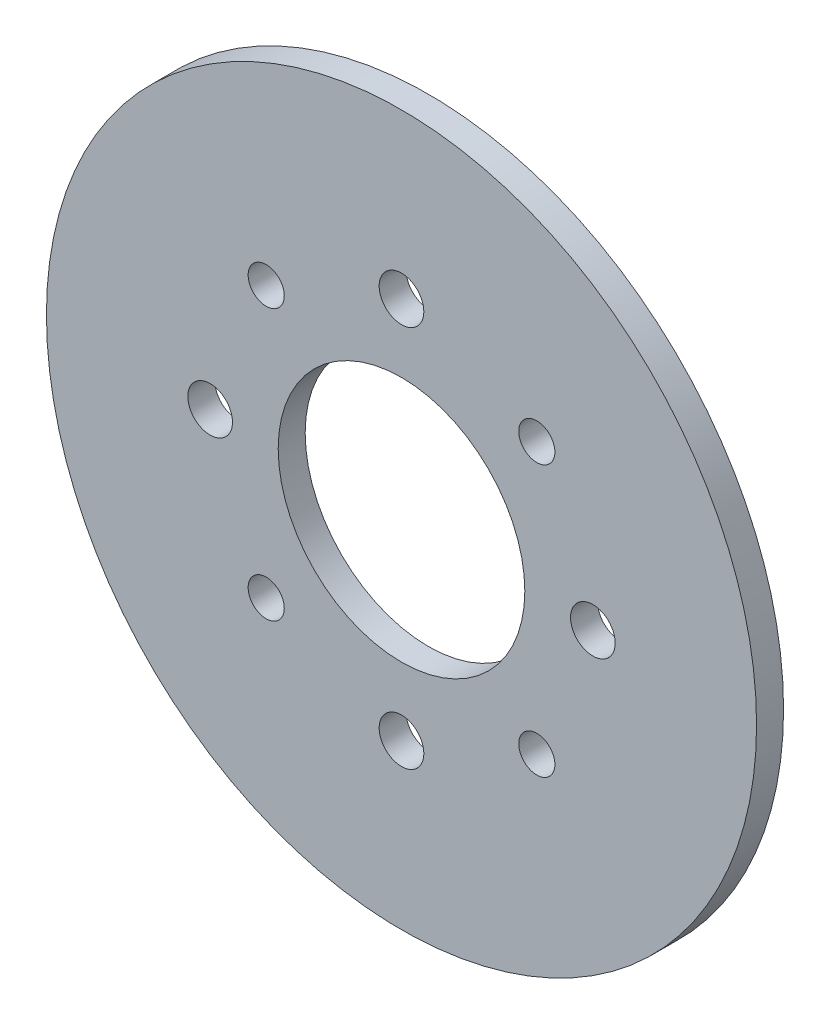
ISO-10303-21;
HEADER;
FILE_DESCRIPTION(('STEP AP214'),'2;1');
FILE_NAME('part.step','',(''),(''),'','','');
FILE_SCHEMA(('AUTOMOTIVE_DESIGN { 1 0 10303 214 1 1 1 1 }'));
ENDSEC;
DATA;
#1=APPLICATION_CONTEXT('core data for automotive mechanical design processes');
#2=APPLICATION_PROTOCOL_DEFINITION('international standard','automotive_design',2000,#1);
#3=PRODUCT_CONTEXT('',#1,'mechanical');
#4=PRODUCT('Part','Part','',(#3));
#5=PRODUCT_RELATED_PRODUCT_CATEGORY('part','',(#4));
#6=PRODUCT_DEFINITION_FORMATION('','',#4);
#7=PRODUCT_DEFINITION_CONTEXT('part definition',#1,'design');
#8=PRODUCT_DEFINITION('design','',#6,#7);
#9=PRODUCT_DEFINITION_SHAPE('','',#8);
#10=(LENGTH_UNIT() NAMED_UNIT(*) SI_UNIT(.MILLI.,.METRE.));
#11=(NAMED_UNIT(*) PLANE_ANGLE_UNIT() SI_UNIT($,.RADIAN.));
#12=(NAMED_UNIT(*) SI_UNIT($,.STERADIAN.) SOLID_ANGLE_UNIT());
#13=UNCERTAINTY_MEASURE_WITH_UNIT(LENGTH_MEASURE(1.E-05),#10,'distance_accuracy_value','');
#14=(GEOMETRIC_REPRESENTATION_CONTEXT(3) GLOBAL_UNCERTAINTY_ASSIGNED_CONTEXT((#13)) GLOBAL_UNIT_ASSIGNED_CONTEXT((#10,
#11,#12)) REPRESENTATION_CONTEXT('',''));
#15=CARTESIAN_POINT('',(0.,0.,0.));
#16=DIRECTION('',(0.,0.,1.));
#17=DIRECTION('',(1.,0.,0.));
#18=AXIS2_PLACEMENT_3D('',#15,#16,#17);
#19=CARTESIAN_POINT('',(0.,0.,6.35));
#20=DIRECTION('',(0.,0.,1.));
#21=DIRECTION('',(1.,0.,0.));
#22=AXIS2_PLACEMENT_3D('',#19,#20,#21);
#23=PLANE('',#22);
#24=CARTESIAN_POINT('',(-31.8198051534,-31.8198051533893,6.35));
#25=DIRECTION('',(0.,0.,1.));
#26=DIRECTION('',(1.,0.,0.));
#27=AXIS2_PLACEMENT_3D('',#24,#25,#26);
#28=CIRCLE('',#27,4.24999999999688);
#29=CARTESIAN_POINT('',(-27.5698051534031,-31.8198051533893,6.35));
#30=VERTEX_POINT('',#29);
#31=EDGE_CURVE('E89',#30,#30,#28,.T.);
#32=ORIENTED_EDGE('',*,*,#31,.F.);
#33=EDGE_LOOP('',(#32));
#34=FACE_BOUND('',#33,.T.);
#35=CARTESIAN_POINT('',(-45.,0.,6.35));
#36=DIRECTION('',(0.,0.,1.));
#37=DIRECTION('',(1.,0.,0.));
#38=AXIS2_PLACEMENT_3D('',#35,#36,#37);
#39=CIRCLE('',#38,5.25);
#40=CARTESIAN_POINT('',(-39.75,0.,6.35));
#41=VERTEX_POINT('',#40);
#42=EDGE_CURVE('E77',#41,#41,#39,.T.);
#43=ORIENTED_EDGE('',*,*,#42,.F.);
#44=EDGE_LOOP('',(#43));
#45=FACE_BOUND('',#44,.T.);
#46=CARTESIAN_POINT('',(45.,0.,6.35));
#47=DIRECTION('',(0.,0.,1.));
#48=DIRECTION('',(1.,0.,0.));
#49=AXIS2_PLACEMENT_3D('',#46,#47,#48);
#50=CIRCLE('',#49,5.25);
#51=CARTESIAN_POINT('',(50.25,0.,6.35));
#52=VERTEX_POINT('',#51);
#53=EDGE_CURVE('E65',#52,#52,#50,.T.);
#54=ORIENTED_EDGE('',*,*,#53,.F.);
#55=EDGE_LOOP('',(#54));
#56=FACE_BOUND('',#55,.T.);
#57=CARTESIAN_POINT('',(0.,45.,6.35));
#58=DIRECTION('',(0.,0.,1.));
#59=DIRECTION('',(1.,0.,0.));
#60=AXIS2_PLACEMENT_3D('',#57,#58,#59);
#61=CIRCLE('',#60,5.25);
#62=CARTESIAN_POINT('',(5.25,45.,6.35));
#63=VERTEX_POINT('',#62);
#64=EDGE_CURVE('E53',#63,#63,#61,.T.);
#65=ORIENTED_EDGE('',*,*,#64,.F.);
#66=EDGE_LOOP('',(#65));
#67=FACE_BOUND('',#66,.T.);
#68=CARTESIAN_POINT('',(0.,0.,6.35));
#69=DIRECTION('',(0.,0.,1.));
#70=DIRECTION('',(1.,0.,0.));
#71=AXIS2_PLACEMENT_3D('',#68,#69,#70);
#72=CIRCLE('',#71,83.5033704758752);
#73=CARTESIAN_POINT('',(83.5033704758752,0.,6.35));
#74=VERTEX_POINT('',#73);
#75=EDGE_CURVE('E10',#74,#74,#72,.T.);
#76=ORIENTED_EDGE('',*,*,#75,.T.);
#77=EDGE_LOOP('',(#76));
#78=FACE_BOUND('',#77,.T.);
#79=CARTESIAN_POINT('',(31.8198051534,31.8198051533893,6.35));
#80=DIRECTION('',(0.,0.,1.));
#81=DIRECTION('',(1.,0.,0.));
#82=AXIS2_PLACEMENT_3D('',#79,#80,#81);
#83=CIRCLE('',#82,4.24999999999288);
#84=CARTESIAN_POINT('',(36.0698051533929,31.8198051533893,6.35));
#85=VERTEX_POINT('',#84);
#86=EDGE_CURVE('E48',#85,#85,#83,.T.);
#87=ORIENTED_EDGE('',*,*,#86,.F.);
#88=EDGE_LOOP('',(#87));
#89=FACE_BOUND('',#88,.T.);
#90=CARTESIAN_POINT('',(0.,0.,6.35));
#91=DIRECTION('',(0.,0.,1.));
#92=DIRECTION('',(1.,0.,0.));
#93=AXIS2_PLACEMENT_3D('',#90,#91,#92);
#94=CIRCLE('',#93,29.);
#95=CARTESIAN_POINT('',(29.,0.,6.35));
#96=VERTEX_POINT('',#95);
#97=EDGE_CURVE('E59',#96,#96,#94,.T.);
#98=ORIENTED_EDGE('',*,*,#97,.F.);
#99=EDGE_LOOP('',(#98));
#100=FACE_BOUND('',#99,.T.);
#101=CARTESIAN_POINT('',(0.,-45.,6.35));
#102=DIRECTION('',(0.,0.,1.));
#103=DIRECTION('',(1.,0.,0.));
#104=AXIS2_PLACEMENT_3D('',#101,#102,#103);
#105=CIRCLE('',#104,5.25);
#106=CARTESIAN_POINT('',(5.25,-45.,6.35));
#107=VERTEX_POINT('',#106);
#108=EDGE_CURVE('E71',#107,#107,#105,.T.);
#109=ORIENTED_EDGE('',*,*,#108,.F.);
#110=EDGE_LOOP('',(#109));
#111=FACE_BOUND('',#110,.T.);
#112=CARTESIAN_POINT('',(31.8198051533893,-31.8198051534,6.35));
#113=DIRECTION('',(0.,0.,1.));
#114=DIRECTION('',(1.,0.,0.));
#115=AXIS2_PLACEMENT_3D('',#112,#113,#114);
#116=CIRCLE('',#115,4.25000000001028);
#117=CARTESIAN_POINT('',(36.0698051533996,-31.8198051534,6.35));
#118=VERTEX_POINT('',#117);
#119=EDGE_CURVE('E83',#118,#118,#116,.T.);
#120=ORIENTED_EDGE('',*,*,#119,.F.);
#121=EDGE_LOOP('',(#120));
#122=FACE_BOUND('',#121,.T.);
#123=CARTESIAN_POINT('',(-31.8198051533893,31.8198051534,6.35));
#124=DIRECTION('',(0.,0.,1.));
#125=DIRECTION('',(1.,0.,0.));
#126=AXIS2_PLACEMENT_3D('',#123,#124,#125);
#127=CIRCLE('',#126,4.24999999998973);
#128=CARTESIAN_POINT('',(-27.5698051533995,31.8198051534,6.35));
#129=VERTEX_POINT('',#128);
#130=EDGE_CURVE('E95',#129,#129,#127,.T.);
#131=ORIENTED_EDGE('',*,*,#130,.F.);
#132=EDGE_LOOP('',(#131));
#133=FACE_BOUND('',#132,.T.);
#134=ADVANCED_FACE('F37',(#34,#45,#56,#67,#78,#89,#100,#111,#122,#133),#23,.T.);
#135=CARTESIAN_POINT('',(0.,0.,0.));
#136=DIRECTION('',(0.,0.,1.));
#137=DIRECTION('',(1.,0.,0.));
#138=AXIS2_PLACEMENT_3D('',#135,#136,#137);
#139=PLANE('',#138);
#140=CARTESIAN_POINT('',(0.,0.,0.));
#141=DIRECTION('',(0.,0.,1.));
#142=DIRECTION('',(1.,0.,0.));
#143=AXIS2_PLACEMENT_3D('',#140,#141,#142);
#144=CIRCLE('',#143,83.5033704758752);
#145=CARTESIAN_POINT('',(83.5033704758752,0.,0.));
#146=VERTEX_POINT('',#145);
#147=EDGE_CURVE('E41',#146,#146,#144,.T.);
#148=ORIENTED_EDGE('',*,*,#147,.F.);
#149=EDGE_LOOP('',(#148));
#150=FACE_BOUND('',#149,.T.);
#151=CARTESIAN_POINT('',(31.8198051534,31.8198051533893,0.));
#152=DIRECTION('',(0.,0.,1.));
#153=DIRECTION('',(1.,0.,0.));
#154=AXIS2_PLACEMENT_3D('',#151,#152,#153);
#155=CIRCLE('',#154,4.24999999999288);
#156=CARTESIAN_POINT('',(36.0698051533929,31.8198051533893,0.));
#157=VERTEX_POINT('',#156);
#158=EDGE_CURVE('E50',#157,#157,#155,.T.);
#159=ORIENTED_EDGE('',*,*,#158,.T.);
#160=EDGE_LOOP('',(#159));
#161=FACE_BOUND('',#160,.T.);
#162=CARTESIAN_POINT('',(0.,45.,0.));
#163=DIRECTION('',(0.,0.,1.));
#164=DIRECTION('',(1.,0.,0.));
#165=AXIS2_PLACEMENT_3D('',#162,#163,#164);
#166=CIRCLE('',#165,5.25);
#167=CARTESIAN_POINT('',(5.25,45.,0.));
#168=VERTEX_POINT('',#167);
#169=EDGE_CURVE('E56',#168,#168,#166,.T.);
#170=ORIENTED_EDGE('',*,*,#169,.T.);
#171=EDGE_LOOP('',(#170));
#172=FACE_BOUND('',#171,.T.);
#173=CARTESIAN_POINT('',(0.,0.,0.));
#174=DIRECTION('',(0.,0.,1.));
#175=DIRECTION('',(1.,0.,0.));
#176=AXIS2_PLACEMENT_3D('',#173,#174,#175);
#177=CIRCLE('',#176,29.);
#178=CARTESIAN_POINT('',(29.,0.,0.));
#179=VERTEX_POINT('',#178);
#180=EDGE_CURVE('E62',#179,#179,#177,.T.);
#181=ORIENTED_EDGE('',*,*,#180,.T.);
#182=EDGE_LOOP('',(#181));
#183=FACE_BOUND('',#182,.T.);
#184=CARTESIAN_POINT('',(45.,0.,0.));
#185=DIRECTION('',(0.,0.,1.));
#186=DIRECTION('',(1.,0.,0.));
#187=AXIS2_PLACEMENT_3D('',#184,#185,#186);
#188=CIRCLE('',#187,5.25);
#189=CARTESIAN_POINT('',(50.25,0.,0.));
#190=VERTEX_POINT('',#189);
#191=EDGE_CURVE('E68',#190,#190,#188,.T.);
#192=ORIENTED_EDGE('',*,*,#191,.T.);
#193=EDGE_LOOP('',(#192));
#194=FACE_BOUND('',#193,.T.);
#195=CARTESIAN_POINT('',(0.,-45.,0.));
#196=DIRECTION('',(0.,0.,1.));
#197=DIRECTION('',(1.,0.,0.));
#198=AXIS2_PLACEMENT_3D('',#195,#196,#197);
#199=CIRCLE('',#198,5.25);
#200=CARTESIAN_POINT('',(5.25,-45.,0.));
#201=VERTEX_POINT('',#200);
#202=EDGE_CURVE('E74',#201,#201,#199,.T.);
#203=ORIENTED_EDGE('',*,*,#202,.T.);
#204=EDGE_LOOP('',(#203));
#205=FACE_BOUND('',#204,.T.);
#206=CARTESIAN_POINT('',(-45.,0.,0.));
#207=DIRECTION('',(0.,0.,1.));
#208=DIRECTION('',(1.,0.,0.));
#209=AXIS2_PLACEMENT_3D('',#206,#207,#208);
#210=CIRCLE('',#209,5.25);
#211=CARTESIAN_POINT('',(-39.75,0.,0.));
#212=VERTEX_POINT('',#211);
#213=EDGE_CURVE('E80',#212,#212,#210,.T.);
#214=ORIENTED_EDGE('',*,*,#213,.T.);
#215=EDGE_LOOP('',(#214));
#216=FACE_BOUND('',#215,.T.);
#217=CARTESIAN_POINT('',(31.8198051533893,-31.8198051534,0.));
#218=DIRECTION('',(0.,0.,1.));
#219=DIRECTION('',(1.,0.,0.));
#220=AXIS2_PLACEMENT_3D('',#217,#218,#219);
#221=CIRCLE('',#220,4.25000000001028);
#222=CARTESIAN_POINT('',(36.0698051533996,-31.8198051534,0.));
#223=VERTEX_POINT('',#222);
#224=EDGE_CURVE('E86',#223,#223,#221,.T.);
#225=ORIENTED_EDGE('',*,*,#224,.T.);
#226=EDGE_LOOP('',(#225));
#227=FACE_BOUND('',#226,.T.);
#228=CARTESIAN_POINT('',(-31.8198051534,-31.8198051533893,0.));
#229=DIRECTION('',(0.,0.,1.));
#230=DIRECTION('',(1.,0.,0.));
#231=AXIS2_PLACEMENT_3D('',#228,#229,#230);
#232=CIRCLE('',#231,4.24999999999688);
#233=CARTESIAN_POINT('',(-27.5698051534031,-31.8198051533893,0.));
#234=VERTEX_POINT('',#233);
#235=EDGE_CURVE('E92',#234,#234,#232,.T.);
#236=ORIENTED_EDGE('',*,*,#235,.T.);
#237=EDGE_LOOP('',(#236));
#238=FACE_BOUND('',#237,.T.);
#239=CARTESIAN_POINT('',(-31.8198051533893,31.8198051534,0.));
#240=DIRECTION('',(0.,0.,1.));
#241=DIRECTION('',(1.,0.,0.));
#242=AXIS2_PLACEMENT_3D('',#239,#240,#241);
#243=CIRCLE('',#242,4.24999999998973);
#244=CARTESIAN_POINT('',(-27.5698051533995,31.8198051534,0.));
#245=VERTEX_POINT('',#244);
#246=EDGE_CURVE('E98',#245,#245,#243,.T.);
#247=ORIENTED_EDGE('',*,*,#246,.T.);
#248=EDGE_LOOP('',(#247));
#249=FACE_BOUND('',#248,.T.);
#250=ADVANCED_FACE('F108',(#150,#161,#172,#183,#194,#205,#216,#227,#238,#249),#139,.F.);
#251=CARTESIAN_POINT('',(0.,0.,6.35));
#252=DIRECTION('',(0.,0.,-1.));
#253=DIRECTION('',(-1.,0.,0.));
#254=AXIS2_PLACEMENT_3D('',#251,#252,#253);
#255=CYLINDRICAL_SURFACE('',#254,83.5033704758752);
#256=ORIENTED_EDGE('',*,*,#75,.F.);
#257=EDGE_LOOP('',(#256));
#258=FACE_BOUND('',#257,.T.);
#259=ORIENTED_EDGE('',*,*,#147,.T.);
#260=EDGE_LOOP('',(#259));
#261=FACE_BOUND('',#260,.T.);
#262=ADVANCED_FACE('F39',(#258,#261),#255,.T.);
#263=CARTESIAN_POINT('',(31.8198051534,31.8198051533893,6.35));
#264=DIRECTION('',(0.,0.,-1.));
#265=DIRECTION('',(-1.,0.,0.));
#266=AXIS2_PLACEMENT_3D('',#263,#264,#265);
#267=CYLINDRICAL_SURFACE('',#266,4.24999999999288);
#268=ORIENTED_EDGE('',*,*,#86,.T.);
#269=EDGE_LOOP('',(#268));
#270=FACE_BOUND('',#269,.T.);
#271=ORIENTED_EDGE('',*,*,#158,.F.);
#272=EDGE_LOOP('',(#271));
#273=FACE_BOUND('',#272,.T.);
#274=ADVANCED_FACE('F118',(#270,#273),#267,.F.);
#275=CARTESIAN_POINT('',(0.,45.,6.35));
#276=DIRECTION('',(0.,0.,-1.));
#277=DIRECTION('',(-1.,0.,0.));
#278=AXIS2_PLACEMENT_3D('',#275,#276,#277);
#279=CYLINDRICAL_SURFACE('',#278,5.25);
#280=ORIENTED_EDGE('',*,*,#64,.T.);
#281=EDGE_LOOP('',(#280));
#282=FACE_BOUND('',#281,.T.);
#283=ORIENTED_EDGE('',*,*,#169,.F.);
#284=EDGE_LOOP('',(#283));
#285=FACE_BOUND('',#284,.T.);
#286=ADVANCED_FACE('F121',(#282,#285),#279,.F.);
#287=CARTESIAN_POINT('',(0.,0.,6.35));
#288=DIRECTION('',(0.,0.,-1.));
#289=DIRECTION('',(-1.,0.,0.));
#290=AXIS2_PLACEMENT_3D('',#287,#288,#289);
#291=CYLINDRICAL_SURFACE('',#290,29.);
#292=ORIENTED_EDGE('',*,*,#97,.T.);
#293=EDGE_LOOP('',(#292));
#294=FACE_BOUND('',#293,.T.);
#295=ORIENTED_EDGE('',*,*,#180,.F.);
#296=EDGE_LOOP('',(#295));
#297=FACE_BOUND('',#296,.T.);
#298=ADVANCED_FACE('F125',(#294,#297),#291,.F.);
#299=CARTESIAN_POINT('',(45.,0.,6.35));
#300=DIRECTION('',(0.,0.,-1.));
#301=DIRECTION('',(-1.,0.,0.));
#302=AXIS2_PLACEMENT_3D('',#299,#300,#301);
#303=CYLINDRICAL_SURFACE('',#302,5.25);
#304=ORIENTED_EDGE('',*,*,#53,.T.);
#305=EDGE_LOOP('',(#304));
#306=FACE_BOUND('',#305,.T.);
#307=ORIENTED_EDGE('',*,*,#191,.F.);
#308=EDGE_LOOP('',(#307));
#309=FACE_BOUND('',#308,.T.);
#310=ADVANCED_FACE('F129',(#306,#309),#303,.F.);
#311=CARTESIAN_POINT('',(0.,-45.,6.35));
#312=DIRECTION('',(0.,0.,-1.));
#313=DIRECTION('',(-1.,0.,0.));
#314=AXIS2_PLACEMENT_3D('',#311,#312,#313);
#315=CYLINDRICAL_SURFACE('',#314,5.25);
#316=ORIENTED_EDGE('',*,*,#108,.T.);
#317=EDGE_LOOP('',(#316));
#318=FACE_BOUND('',#317,.T.);
#319=ORIENTED_EDGE('',*,*,#202,.F.);
#320=EDGE_LOOP('',(#319));
#321=FACE_BOUND('',#320,.T.);
#322=ADVANCED_FACE('F133',(#318,#321),#315,.F.);
#323=CARTESIAN_POINT('',(-45.,0.,6.35));
#324=DIRECTION('',(0.,0.,-1.));
#325=DIRECTION('',(-1.,0.,0.));
#326=AXIS2_PLACEMENT_3D('',#323,#324,#325);
#327=CYLINDRICAL_SURFACE('',#326,5.25);
#328=ORIENTED_EDGE('',*,*,#42,.T.);
#329=EDGE_LOOP('',(#328));
#330=FACE_BOUND('',#329,.T.);
#331=ORIENTED_EDGE('',*,*,#213,.F.);
#332=EDGE_LOOP('',(#331));
#333=FACE_BOUND('',#332,.T.);
#334=ADVANCED_FACE('F137',(#330,#333),#327,.F.);
#335=CARTESIAN_POINT('',(31.8198051533893,-31.8198051534,6.35));
#336=DIRECTION('',(0.,0.,-1.));
#337=DIRECTION('',(-1.,0.,0.));
#338=AXIS2_PLACEMENT_3D('',#335,#336,#337);
#339=CYLINDRICAL_SURFACE('',#338,4.25000000001028);
#340=ORIENTED_EDGE('',*,*,#119,.T.);
#341=EDGE_LOOP('',(#340));
#342=FACE_BOUND('',#341,.T.);
#343=ORIENTED_EDGE('',*,*,#224,.F.);
#344=EDGE_LOOP('',(#343));
#345=FACE_BOUND('',#344,.T.);
#346=ADVANCED_FACE('F141',(#342,#345),#339,.F.);
#347=CARTESIAN_POINT('',(-31.8198051534,-31.8198051533893,6.35));
#348=DIRECTION('',(0.,0.,-1.));
#349=DIRECTION('',(-1.,0.,0.));
#350=AXIS2_PLACEMENT_3D('',#347,#348,#349);
#351=CYLINDRICAL_SURFACE('',#350,4.24999999999688);
#352=ORIENTED_EDGE('',*,*,#31,.T.);
#353=EDGE_LOOP('',(#352));
#354=FACE_BOUND('',#353,.T.);
#355=ORIENTED_EDGE('',*,*,#235,.F.);
#356=EDGE_LOOP('',(#355));
#357=FACE_BOUND('',#356,.T.);
#358=ADVANCED_FACE('F145',(#354,#357),#351,.F.);
#359=CARTESIAN_POINT('',(-31.8198051533893,31.8198051534,6.35));
#360=DIRECTION('',(0.,0.,-1.));
#361=DIRECTION('',(-1.,0.,0.));
#362=AXIS2_PLACEMENT_3D('',#359,#360,#361);
#363=CYLINDRICAL_SURFACE('',#362,4.24999999998973);
#364=ORIENTED_EDGE('',*,*,#130,.T.);
#365=EDGE_LOOP('',(#364));
#366=FACE_BOUND('',#365,.T.);
#367=ORIENTED_EDGE('',*,*,#246,.F.);
#368=EDGE_LOOP('',(#367));
#369=FACE_BOUND('',#368,.T.);
#370=ADVANCED_FACE('F104',(#366,#369),#363,.F.);
#371=CLOSED_SHELL('',(#134,#250,#262,#274,#286,#298,#310,#322,#334,#346,#358,#370));
#372=MANIFOLD_SOLID_BREP('B2',#371);
#373=ADVANCED_BREP_SHAPE_REPRESENTATION('',(#18,#372),#14);
#374=SHAPE_DEFINITION_REPRESENTATION(#9,#373);
ENDSEC;
END-ISO-10303-21;
